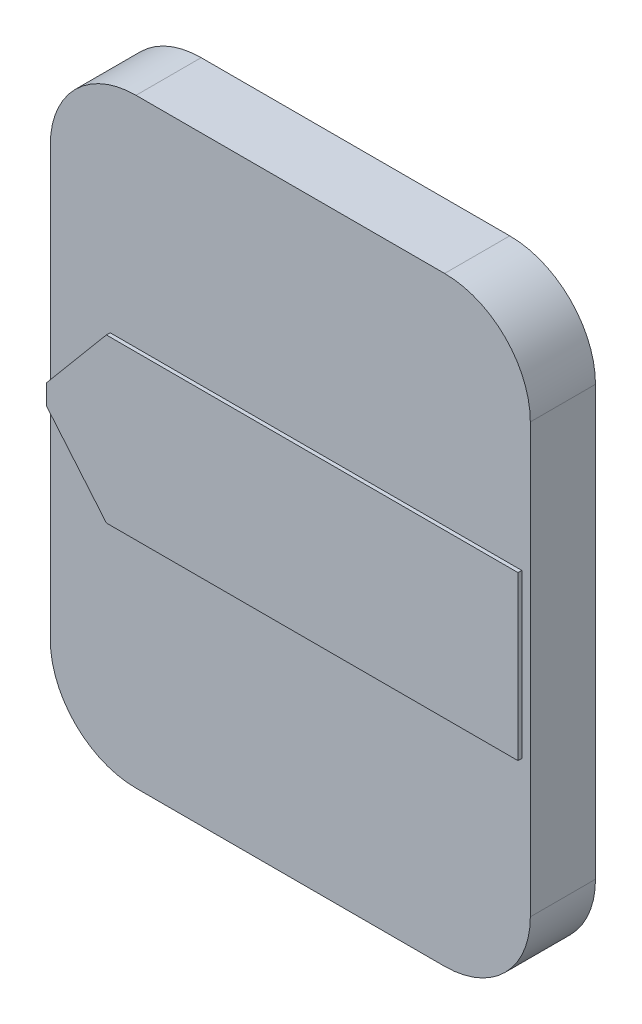
ISO-10303-21;
HEADER;
FILE_DESCRIPTION(('STEP AP214'),'2;1');
FILE_NAME('part.step','',(''),(''),'','','');
FILE_SCHEMA(('AUTOMOTIVE_DESIGN { 1 0 10303 214 1 1 1 1 }'));
ENDSEC;
DATA;
#1=APPLICATION_CONTEXT('core data for automotive mechanical design processes');
#2=APPLICATION_PROTOCOL_DEFINITION('international standard','automotive_design',2000,#1);
#3=PRODUCT_CONTEXT('',#1,'mechanical');
#4=PRODUCT('Part','Part','',(#3));
#5=PRODUCT_RELATED_PRODUCT_CATEGORY('part','',(#4));
#6=PRODUCT_DEFINITION_FORMATION('','',#4);
#7=PRODUCT_DEFINITION_CONTEXT('part definition',#1,'design');
#8=PRODUCT_DEFINITION('design','',#6,#7);
#9=PRODUCT_DEFINITION_SHAPE('','',#8);
#10=(LENGTH_UNIT() NAMED_UNIT(*) SI_UNIT(.MILLI.,.METRE.));
#11=(NAMED_UNIT(*) PLANE_ANGLE_UNIT() SI_UNIT($,.RADIAN.));
#12=(NAMED_UNIT(*) SI_UNIT($,.STERADIAN.) SOLID_ANGLE_UNIT());
#13=UNCERTAINTY_MEASURE_WITH_UNIT(LENGTH_MEASURE(1.E-05),#10,'distance_accuracy_value','');
#14=(GEOMETRIC_REPRESENTATION_CONTEXT(3) GLOBAL_UNCERTAINTY_ASSIGNED_CONTEXT((#13)) GLOBAL_UNIT_ASSIGNED_CONTEXT((#10,
#11,#12)) REPRESENTATION_CONTEXT('',''));
#15=CARTESIAN_POINT('',(0.,0.,0.));
#16=DIRECTION('',(0.,0.,1.));
#17=DIRECTION('',(1.,0.,0.));
#18=AXIS2_PLACEMENT_3D('',#15,#16,#17);
#19=CARTESIAN_POINT('',(2.79999999999999,3.50004913845652,-0.38));
#20=DIRECTION('',(0.,0.,1.));
#21=DIRECTION('',(1.,0.,0.));
#22=AXIS2_PLACEMENT_3D('',#19,#20,#21);
#23=PLANE('',#22);
#24=DIRECTION('',(0.,1.,0.));
#25=VECTOR('',#24,1.);
#26=CARTESIAN_POINT('',(2.79999999999999,-2.41954770021507E-08,-0.38));
#27=LINE('',#26,#25);
#28=CARTESIAN_POINT('',(2.79999999999999,0.499999975804522,-0.38));
#29=VERTEX_POINT('',#28);
#30=CARTESIAN_POINT('',(2.79999999999999,3.00004913845652,-0.38));
#31=VERTEX_POINT('',#30);
#32=EDGE_CURVE('E273',#29,#31,#27,.T.);
#33=ORIENTED_EDGE('',*,*,#32,.F.);
#34=CARTESIAN_POINT('',(2.29999999999999,0.499999975804522,-0.38));
#35=DIRECTION('',(0.,0.,1.));
#36=DIRECTION('',(1.,0.,0.));
#37=AXIS2_PLACEMENT_3D('',#34,#35,#36);
#38=CIRCLE('',#37,0.499999999999999);
#39=CARTESIAN_POINT('',(2.29999999999999,-2.41954770019587E-08,-0.38));
#40=VERTEX_POINT('',#39);
#41=EDGE_CURVE('E299',#29,#40,#38,.F.);
#42=ORIENTED_EDGE('',*,*,#41,.T.);
#43=DIRECTION('',(1.,0.,0.));
#44=VECTOR('',#43,1.);
#45=CARTESIAN_POINT('',(0.,-2.41954770010754E-08,-0.38));
#46=LINE('',#45,#44);
#47=CARTESIAN_POINT('',(0.499999999999978,-2.41954770012674E-08,-0.38));
#48=VERTEX_POINT('',#47);
#49=EDGE_CURVE('E277',#48,#40,#46,.T.);
#50=ORIENTED_EDGE('',*,*,#49,.F.);
#51=CARTESIAN_POINT('',(0.499999999999978,0.499999975804522,-0.38));
#52=DIRECTION('',(0.,0.,1.));
#53=DIRECTION('',(1.,0.,0.));
#54=AXIS2_PLACEMENT_3D('',#51,#52,#53);
#55=CIRCLE('',#54,0.499999999999999);
#56=CARTESIAN_POINT('',(0.,0.499999975804522,-0.38));
#57=VERTEX_POINT('',#56);
#58=EDGE_CURVE('E297',#48,#57,#55,.F.);
#59=ORIENTED_EDGE('',*,*,#58,.T.);
#60=DIRECTION('',(0.,-1.,0.));
#61=VECTOR('',#60,1.);
#62=CARTESIAN_POINT('',(0.,3.50004913845652,-0.38));
#63=LINE('',#62,#61);
#64=CARTESIAN_POINT('',(0.,3.00004913845652,-0.38));
#65=VERTEX_POINT('',#64);
#66=EDGE_CURVE('E322',#65,#57,#63,.T.);
#67=ORIENTED_EDGE('',*,*,#66,.F.);
#68=CARTESIAN_POINT('',(0.499999999999978,3.00004913845652,-0.38));
#69=DIRECTION('',(0.,0.,1.));
#70=DIRECTION('',(1.,0.,0.));
#71=AXIS2_PLACEMENT_3D('',#68,#69,#70);
#72=CIRCLE('',#71,0.499999999999999);
#73=CARTESIAN_POINT('',(0.499999999999979,3.50004913845652,-0.38));
#74=VERTEX_POINT('',#73);
#75=EDGE_CURVE('E295',#65,#74,#72,.F.);
#76=ORIENTED_EDGE('',*,*,#75,.T.);
#77=DIRECTION('',(-1.,0.,0.));
#78=VECTOR('',#77,1.);
#79=CARTESIAN_POINT('',(2.79999999999999,3.50004913845652,-0.38));
#80=LINE('',#79,#78);
#81=CARTESIAN_POINT('',(2.29999999999999,3.50004913845652,-0.38));
#82=VERTEX_POINT('',#81);
#83=EDGE_CURVE('E312',#82,#74,#80,.T.);
#84=ORIENTED_EDGE('',*,*,#83,.F.);
#85=CARTESIAN_POINT('',(2.29999999999999,3.00004913845652,-0.38));
#86=DIRECTION('',(0.,0.,1.));
#87=DIRECTION('',(1.,0.,0.));
#88=AXIS2_PLACEMENT_3D('',#85,#86,#87);
#89=CIRCLE('',#88,0.499999999999999);
#90=EDGE_CURVE('E293',#82,#31,#89,.F.);
#91=ORIENTED_EDGE('',*,*,#90,.T.);
#92=EDGE_LOOP('',(#33,#42,#50,#59,#67,#76,#84,#91));
#93=FACE_BOUND('',#92,.T.);
#94=CARTESIAN_POINT('',(2.29999999999999,3.00004913845652,-0.38));
#95=DIRECTION('',(0.,0.,-1.));
#96=DIRECTION('',(-1.,0.,0.));
#97=AXIS2_PLACEMENT_3D('',#94,#95,#96);
#98=CIRCLE('',#97,0.4);
#99=CARTESIAN_POINT('',(2.29999999999999,3.40004913845652,-0.38));
#100=VERTEX_POINT('',#99);
#101=CARTESIAN_POINT('',(2.69999999999999,3.00004913845652,-0.38));
#102=VERTEX_POINT('',#101);
#103=EDGE_CURVE('E203',#100,#102,#98,.T.);
#104=ORIENTED_EDGE('',*,*,#103,.F.);
#105=DIRECTION('',(1.,0.,0.));
#106=VECTOR('',#105,1.);
#107=CARTESIAN_POINT('',(0.499999999999979,3.40004913845652,-0.38));
#108=LINE('',#107,#106);
#109=CARTESIAN_POINT('',(0.499999999999979,3.40004913845652,-0.38));
#110=VERTEX_POINT('',#109);
#111=EDGE_CURVE('E200',#110,#100,#108,.T.);
#112=ORIENTED_EDGE('',*,*,#111,.F.);
#113=CARTESIAN_POINT('',(0.499999999999978,3.00004913845652,-0.38));
#114=DIRECTION('',(0.,0.,-1.));
#115=DIRECTION('',(-1.,0.,0.));
#116=AXIS2_PLACEMENT_3D('',#113,#114,#115);
#117=CIRCLE('',#116,0.399999999999999);
#118=CARTESIAN_POINT('',(0.0999999999999787,3.00004913845652,-0.38));
#119=VERTEX_POINT('',#118);
#120=EDGE_CURVE('E534',#119,#110,#117,.T.);
#121=ORIENTED_EDGE('',*,*,#120,.F.);
#122=DIRECTION('',(0.,1.,0.));
#123=VECTOR('',#122,1.);
#124=CARTESIAN_POINT('',(0.0999999999999789,0.499999975804522,-0.38));
#125=LINE('',#124,#123);
#126=CARTESIAN_POINT('',(0.0999999999999791,0.499999975804522,-0.38));
#127=VERTEX_POINT('',#126);
#128=EDGE_CURVE('E565',#127,#119,#125,.T.);
#129=ORIENTED_EDGE('',*,*,#128,.F.);
#130=CARTESIAN_POINT('',(0.499999999999978,0.499999975804522,-0.38));
#131=DIRECTION('',(0.,0.,-1.));
#132=DIRECTION('',(-1.,0.,0.));
#133=AXIS2_PLACEMENT_3D('',#130,#131,#132);
#134=CIRCLE('',#133,0.399999999999999);
#135=CARTESIAN_POINT('',(0.499999999999977,0.099999975804523,-0.38));
#136=VERTEX_POINT('',#135);
#137=EDGE_CURVE('E558',#136,#127,#134,.T.);
#138=ORIENTED_EDGE('',*,*,#137,.F.);
#139=DIRECTION('',(-1.,0.,0.));
#140=VECTOR('',#139,1.);
#141=CARTESIAN_POINT('',(2.29999999999999,0.0999999758045229,-0.38));
#142=LINE('',#141,#140);
#143=CARTESIAN_POINT('',(2.29999999999999,0.0999999758045231,-0.38));
#144=VERTEX_POINT('',#143);
#145=EDGE_CURVE('E555',#144,#136,#142,.T.);
#146=ORIENTED_EDGE('',*,*,#145,.F.);
#147=CARTESIAN_POINT('',(2.29999999999999,0.499999975804522,-0.38));
#148=DIRECTION('',(0.,0.,-1.));
#149=DIRECTION('',(-1.,0.,0.));
#150=AXIS2_PLACEMENT_3D('',#147,#148,#149);
#151=CIRCLE('',#150,0.399999999999999);
#152=CARTESIAN_POINT('',(2.69999999999999,0.499999975804522,-0.38));
#153=VERTEX_POINT('',#152);
#154=EDGE_CURVE('E54',#153,#144,#151,.T.);
#155=ORIENTED_EDGE('',*,*,#154,.F.);
#156=DIRECTION('',(0.,-1.,0.));
#157=VECTOR('',#156,1.);
#158=CARTESIAN_POINT('',(2.69999999999999,3.00004913845652,-0.38));
#159=LINE('',#158,#157);
#160=EDGE_CURVE('E49',#102,#153,#159,.T.);
#161=ORIENTED_EDGE('',*,*,#160,.F.);
#162=EDGE_LOOP('',(#104,#112,#121,#129,#138,#146,#155,#161));
#163=FACE_BOUND('',#162,.T.);
#164=ADVANCED_FACE('F32',(#93,#163),#23,.F.);
#165=CARTESIAN_POINT('',(2.79999999999999,-2.41954770021507E-08,-0.38));
#166=DIRECTION('',(1.,0.,0.));
#167=DIRECTION('',(0.,0.,-1.));
#168=AXIS2_PLACEMENT_3D('',#165,#166,#167);
#169=PLANE('',#168);
#170=DIRECTION('',(0.,1.,0.));
#171=VECTOR('',#170,1.);
#172=CARTESIAN_POINT('',(2.79999999999999,-2.41954770021507E-08,0.));
#173=LINE('',#172,#171);
#174=CARTESIAN_POINT('',(2.79999999999999,0.499999975804522,0.));
#175=VERTEX_POINT('',#174);
#176=CARTESIAN_POINT('',(2.79999999999999,3.00004913845652,0.));
#177=VERTEX_POINT('',#176);
#178=EDGE_CURVE('E329',#175,#177,#173,.T.);
#179=ORIENTED_EDGE('',*,*,#178,.F.);
#180=DIRECTION('',(0.,0.,1.));
#181=VECTOR('',#180,1.);
#182=CARTESIAN_POINT('',(2.79999999999999,0.499999975804522,-0.38));
#183=LINE('',#182,#181);
#184=EDGE_CURVE('E291',#175,#29,#183,.F.);
#185=ORIENTED_EDGE('',*,*,#184,.T.);
#186=ORIENTED_EDGE('',*,*,#32,.T.);
#187=DIRECTION('',(0.,0.,1.));
#188=VECTOR('',#187,1.);
#189=CARTESIAN_POINT('',(2.79999999999999,3.00004913845652,-0.38));
#190=LINE('',#189,#188);
#191=EDGE_CURVE('E288',#31,#177,#190,.T.);
#192=ORIENTED_EDGE('',*,*,#191,.T.);
#193=EDGE_LOOP('',(#179,#185,#186,#192));
#194=FACE_BOUND('',#193,.T.);
#195=ADVANCED_FACE('F328',(#194),#169,.T.);
#196=CARTESIAN_POINT('',(0.,-2.41954770010754E-08,-0.38));
#197=DIRECTION('',(0.,-1.,0.));
#198=DIRECTION('',(1.,0.,0.));
#199=AXIS2_PLACEMENT_3D('',#196,#197,#198);
#200=PLANE('',#199);
#201=ORIENTED_EDGE('',*,*,#49,.T.);
#202=DIRECTION('',(0.,0.,1.));
#203=VECTOR('',#202,1.);
#204=CARTESIAN_POINT('',(2.29999999999999,-2.41954770019587E-08,-0.38));
#205=LINE('',#204,#203);
#206=CARTESIAN_POINT('',(2.29999999999999,-2.41954770019587E-08,0.));
#207=VERTEX_POINT('',#206);
#208=EDGE_CURVE('E276',#40,#207,#205,.T.);
#209=ORIENTED_EDGE('',*,*,#208,.T.);
#210=DIRECTION('',(1.,0.,0.));
#211=VECTOR('',#210,1.);
#212=CARTESIAN_POINT('',(0.,-2.41954770010754E-08,0.));
#213=LINE('',#212,#211);
#214=CARTESIAN_POINT('',(0.499999999999978,-2.41954770012674E-08,0.));
#215=VERTEX_POINT('',#214);
#216=EDGE_CURVE('E269',#215,#207,#213,.T.);
#217=ORIENTED_EDGE('',*,*,#216,.F.);
#218=DIRECTION('',(0.,0.,1.));
#219=VECTOR('',#218,1.);
#220=CARTESIAN_POINT('',(0.499999999999978,-2.41954770012674E-08,-0.38));
#221=LINE('',#220,#219);
#222=EDGE_CURVE('E274',#215,#48,#221,.F.);
#223=ORIENTED_EDGE('',*,*,#222,.T.);
#224=EDGE_LOOP('',(#201,#209,#217,#223));
#225=FACE_BOUND('',#224,.T.);
#226=ADVANCED_FACE('F368',(#225),#200,.T.);
#227=CARTESIAN_POINT('',(0.,3.50004913845652,-0.38));
#228=DIRECTION('',(-1.,0.,0.));
#229=DIRECTION('',(0.,-1.,0.));
#230=AXIS2_PLACEMENT_3D('',#227,#228,#229);
#231=PLANE('',#230);
#232=ORIENTED_EDGE('',*,*,#66,.T.);
#233=DIRECTION('',(0.,0.,1.));
#234=VECTOR('',#233,1.);
#235=CARTESIAN_POINT('',(0.,0.499999975804522,-0.38));
#236=LINE('',#235,#234);
#237=CARTESIAN_POINT('',(0.,0.499999975804522,0.));
#238=VERTEX_POINT('',#237);
#239=EDGE_CURVE('E303',#57,#238,#236,.T.);
#240=ORIENTED_EDGE('',*,*,#239,.T.);
#241=DIRECTION('',(0.,-1.,0.));
#242=VECTOR('',#241,1.);
#243=CARTESIAN_POINT('',(0.,3.50004913845652,0.));
#244=LINE('',#243,#242);
#245=CARTESIAN_POINT('',(0.,1.6911000918899,0.));
#246=VERTEX_POINT('',#245);
#247=EDGE_CURVE('E260',#246,#238,#244,.T.);
#248=ORIENTED_EDGE('',*,*,#247,.F.);
#249=DIRECTION('',(0.,0.,-1.));
#250=VECTOR('',#249,1.);
#251=CARTESIAN_POINT('',(0.,1.6911000918899,0.022));
#252=LINE('',#251,#250);
#253=CARTESIAN_POINT('',(0.,1.6911000918899,0.022));
#254=VERTEX_POINT('',#253);
#255=EDGE_CURVE('E227',#254,#246,#252,.T.);
#256=ORIENTED_EDGE('',*,*,#255,.F.);
#257=DIRECTION('',(0.,-1.,0.));
#258=VECTOR('',#257,1.);
#259=CARTESIAN_POINT('',(0.,1.6911000918899,0.022));
#260=LINE('',#259,#258);
#261=CARTESIAN_POINT('',(0.,1.80894902237119,0.022));
#262=VERTEX_POINT('',#261);
#263=EDGE_CURVE('E225',#262,#254,#260,.T.);
#264=ORIENTED_EDGE('',*,*,#263,.F.);
#265=DIRECTION('',(0.,0.,-1.));
#266=VECTOR('',#265,1.);
#267=CARTESIAN_POINT('',(0.,1.80894902237119,0.022));
#268=LINE('',#267,#266);
#269=CARTESIAN_POINT('',(0.,1.80894902237119,0.));
#270=VERTEX_POINT('',#269);
#271=EDGE_CURVE('E245',#262,#270,#268,.T.);
#272=ORIENTED_EDGE('',*,*,#271,.T.);
#273=CARTESIAN_POINT('',(0.,3.00004913845652,0.));
#274=VERTEX_POINT('',#273);
#275=EDGE_CURVE('E263',#274,#270,#244,.T.);
#276=ORIENTED_EDGE('',*,*,#275,.F.);
#277=DIRECTION('',(0.,0.,1.));
#278=VECTOR('',#277,1.);
#279=CARTESIAN_POINT('',(0.,3.00004913845652,-0.38));
#280=LINE('',#279,#278);
#281=EDGE_CURVE('E301',#274,#65,#280,.F.);
#282=ORIENTED_EDGE('',*,*,#281,.T.);
#283=EDGE_LOOP('',(#232,#240,#248,#256,#264,#272,#276,#282));
#284=FACE_BOUND('',#283,.T.);
#285=ADVANCED_FACE('F360',(#284),#231,.T.);
#286=CARTESIAN_POINT('',(2.79999999999999,3.50004913845652,-0.38));
#287=DIRECTION('',(0.,1.,0.));
#288=DIRECTION('',(0.,0.,1.));
#289=AXIS2_PLACEMENT_3D('',#286,#287,#288);
#290=PLANE('',#289);
#291=ORIENTED_EDGE('',*,*,#83,.T.);
#292=DIRECTION('',(0.,0.,1.));
#293=VECTOR('',#292,1.);
#294=CARTESIAN_POINT('',(0.499999999999978,3.50004913845652,-0.38));
#295=LINE('',#294,#293);
#296=CARTESIAN_POINT('',(0.499999999999979,3.50004913845652,0.));
#297=VERTEX_POINT('',#296);
#298=EDGE_CURVE('E11',#74,#297,#295,.T.);
#299=ORIENTED_EDGE('',*,*,#298,.T.);
#300=DIRECTION('',(-1.,0.,0.));
#301=VECTOR('',#300,1.);
#302=CARTESIAN_POINT('',(2.79999999999999,3.50004913845652,0.));
#303=LINE('',#302,#301);
#304=CARTESIAN_POINT('',(2.29999999999999,3.50004913845652,0.));
#305=VERTEX_POINT('',#304);
#306=EDGE_CURVE('E264',#305,#297,#303,.T.);
#307=ORIENTED_EDGE('',*,*,#306,.F.);
#308=DIRECTION('',(0.,0.,1.));
#309=VECTOR('',#308,1.);
#310=CARTESIAN_POINT('',(2.29999999999999,3.50004913845652,-0.38));
#311=LINE('',#310,#309);
#312=EDGE_CURVE('E41',#305,#82,#311,.F.);
#313=ORIENTED_EDGE('',*,*,#312,.T.);
#314=EDGE_LOOP('',(#291,#299,#307,#313));
#315=FACE_BOUND('',#314,.T.);
#316=ADVANCED_FACE('F311',(#315),#290,.T.);
#317=CARTESIAN_POINT('',(2.79999999999999,3.50004913845652,0.));
#318=DIRECTION('',(0.,0.,1.));
#319=DIRECTION('',(1.,0.,0.));
#320=AXIS2_PLACEMENT_3D('',#317,#318,#319);
#321=PLANE('',#320);
#322=DIRECTION('',(0.642864495372613,-0.765979921792547,0.));
#323=VECTOR('',#322,1.);
#324=CARTESIAN_POINT('',(0.34919999999998,1.27502455713055,0.));
#325=LINE('',#324,#323);
#326=CARTESIAN_POINT('',(0.34919999999998,1.27502455713055,0.));
#327=VERTEX_POINT('',#326);
#328=EDGE_CURVE('E204',#246,#327,#325,.T.);
#329=ORIENTED_EDGE('',*,*,#328,.F.);
#330=ORIENTED_EDGE('',*,*,#247,.T.);
#331=CARTESIAN_POINT('',(0.499999999999978,0.499999975804522,0.));
#332=DIRECTION('',(0.,0.,1.));
#333=DIRECTION('',(1.,0.,0.));
#334=AXIS2_PLACEMENT_3D('',#331,#332,#333);
#335=CIRCLE('',#334,0.499999999999999);
#336=EDGE_CURVE('E284',#238,#215,#335,.T.);
#337=ORIENTED_EDGE('',*,*,#336,.T.);
#338=ORIENTED_EDGE('',*,*,#216,.T.);
#339=CARTESIAN_POINT('',(2.29999999999999,0.499999975804522,0.));
#340=DIRECTION('',(0.,0.,1.));
#341=DIRECTION('',(1.,0.,0.));
#342=AXIS2_PLACEMENT_3D('',#339,#340,#341);
#343=CIRCLE('',#342,0.499999999999999);
#344=EDGE_CURVE('E286',#207,#175,#343,.T.);
#345=ORIENTED_EDGE('',*,*,#344,.T.);
#346=ORIENTED_EDGE('',*,*,#178,.T.);
#347=CARTESIAN_POINT('',(2.29999999999999,3.00004913845652,0.));
#348=DIRECTION('',(0.,0.,1.));
#349=DIRECTION('',(1.,0.,0.));
#350=AXIS2_PLACEMENT_3D('',#347,#348,#349);
#351=CIRCLE('',#350,0.499999999999999);
#352=EDGE_CURVE('E280',#177,#305,#351,.T.);
#353=ORIENTED_EDGE('',*,*,#352,.T.);
#354=ORIENTED_EDGE('',*,*,#306,.T.);
#355=CARTESIAN_POINT('',(0.499999999999978,3.00004913845652,0.));
#356=DIRECTION('',(0.,0.,1.));
#357=DIRECTION('',(1.,0.,0.));
#358=AXIS2_PLACEMENT_3D('',#355,#356,#357);
#359=CIRCLE('',#358,0.499999999999999);
#360=EDGE_CURVE('E282',#297,#274,#359,.T.);
#361=ORIENTED_EDGE('',*,*,#360,.T.);
#362=ORIENTED_EDGE('',*,*,#275,.T.);
#363=DIRECTION('',(-0.642864495372605,-0.765979921792554,0.));
#364=VECTOR('',#363,1.);
#365=CARTESIAN_POINT('',(0.,1.80894902237119,0.));
#366=LINE('',#365,#364);
#367=CARTESIAN_POINT('',(0.349199999999977,2.22502455713055,0.));
#368=VERTEX_POINT('',#367);
#369=EDGE_CURVE('E217',#368,#270,#366,.T.);
#370=ORIENTED_EDGE('',*,*,#369,.F.);
#371=DIRECTION('',(-1.,0.,0.));
#372=VECTOR('',#371,1.);
#373=CARTESIAN_POINT('',(0.349199999999977,2.22502455713055,0.));
#374=LINE('',#373,#372);
#375=CARTESIAN_POINT('',(2.74999999999999,2.22502455713054,0.));
#376=VERTEX_POINT('',#375);
#377=EDGE_CURVE('E233',#376,#368,#374,.T.);
#378=ORIENTED_EDGE('',*,*,#377,.F.);
#379=DIRECTION('',(0.,1.,0.));
#380=VECTOR('',#379,1.);
#381=CARTESIAN_POINT('',(2.74999999999999,2.22502455713054,0.));
#382=LINE('',#381,#380);
#383=CARTESIAN_POINT('',(2.74999999999999,1.27502455713055,0.));
#384=VERTEX_POINT('',#383);
#385=EDGE_CURVE('E230',#384,#376,#382,.T.);
#386=ORIENTED_EDGE('',*,*,#385,.F.);
#387=DIRECTION('',(1.,0.,0.));
#388=VECTOR('',#387,1.);
#389=CARTESIAN_POINT('',(2.74999999999999,1.27502455713055,0.));
#390=LINE('',#389,#388);
#391=EDGE_CURVE('E207',#327,#384,#390,.T.);
#392=ORIENTED_EDGE('',*,*,#391,.F.);
#393=EDGE_LOOP('',(#329,#330,#337,#338,#345,#346,#353,#354,#361,#362,#370,#378,#386,#392));
#394=FACE_BOUND('',#393,.T.);
#395=ADVANCED_FACE('F332',(#394),#321,.T.);
#396=CARTESIAN_POINT('',(2.29999999999999,0.499999975804522,-0.38));
#397=DIRECTION('',(0.,0.,1.));
#398=DIRECTION('',(1.,0.,0.));
#399=AXIS2_PLACEMENT_3D('',#396,#397,#398);
#400=CYLINDRICAL_SURFACE('',#399,0.499999999999999);
#401=ORIENTED_EDGE('',*,*,#41,.F.);
#402=ORIENTED_EDGE('',*,*,#184,.F.);
#403=ORIENTED_EDGE('',*,*,#344,.F.);
#404=ORIENTED_EDGE('',*,*,#208,.F.);
#405=EDGE_LOOP('',(#401,#402,#403,#404));
#406=FACE_BOUND('',#405,.T.);
#407=ADVANCED_FACE('F373',(#406),#400,.T.);
#408=CARTESIAN_POINT('',(0.499999999999978,0.499999975804522,-0.38));
#409=DIRECTION('',(0.,0.,1.));
#410=DIRECTION('',(1.,0.,0.));
#411=AXIS2_PLACEMENT_3D('',#408,#409,#410);
#412=CYLINDRICAL_SURFACE('',#411,0.499999999999999);
#413=ORIENTED_EDGE('',*,*,#58,.F.);
#414=ORIENTED_EDGE('',*,*,#222,.F.);
#415=ORIENTED_EDGE('',*,*,#336,.F.);
#416=ORIENTED_EDGE('',*,*,#239,.F.);
#417=EDGE_LOOP('',(#413,#414,#415,#416));
#418=FACE_BOUND('',#417,.T.);
#419=ADVANCED_FACE('F364',(#418),#412,.T.);
#420=CARTESIAN_POINT('',(0.499999999999978,3.00004913845652,-0.38));
#421=DIRECTION('',(0.,0.,1.));
#422=DIRECTION('',(1.,0.,0.));
#423=AXIS2_PLACEMENT_3D('',#420,#421,#422);
#424=CYLINDRICAL_SURFACE('',#423,0.499999999999999);
#425=ORIENTED_EDGE('',*,*,#75,.F.);
#426=ORIENTED_EDGE('',*,*,#281,.F.);
#427=ORIENTED_EDGE('',*,*,#360,.F.);
#428=ORIENTED_EDGE('',*,*,#298,.F.);
#429=EDGE_LOOP('',(#425,#426,#427,#428));
#430=FACE_BOUND('',#429,.T.);
#431=ADVANCED_FACE('F376',(#430),#424,.T.);
#432=CARTESIAN_POINT('',(2.29999999999999,3.00004913845652,-0.38));
#433=DIRECTION('',(0.,0.,1.));
#434=DIRECTION('',(1.,0.,0.));
#435=AXIS2_PLACEMENT_3D('',#432,#433,#434);
#436=CYLINDRICAL_SURFACE('',#435,0.499999999999999);
#437=ORIENTED_EDGE('',*,*,#90,.F.);
#438=ORIENTED_EDGE('',*,*,#312,.F.);
#439=ORIENTED_EDGE('',*,*,#352,.F.);
#440=ORIENTED_EDGE('',*,*,#191,.F.);
#441=EDGE_LOOP('',(#437,#438,#439,#440));
#442=FACE_BOUND('',#441,.T.);
#443=ADVANCED_FACE('F34',(#442),#436,.T.);
#444=CARTESIAN_POINT('',(0.34919999999998,1.27502455713055,0.022));
#445=DIRECTION('',(0.765979921792547,0.642864495372612,0.));
#446=DIRECTION('',(-0.642864495372612,0.765979921792547,0.));
#447=AXIS2_PLACEMENT_3D('',#444,#445,#446);
#448=PLANE('',#447);
#449=ORIENTED_EDGE('',*,*,#328,.T.);
#450=DIRECTION('',(0.,0.,-1.));
#451=VECTOR('',#450,1.);
#452=CARTESIAN_POINT('',(0.34919999999998,1.27502455713055,0.022));
#453=LINE('',#452,#451);
#454=CARTESIAN_POINT('',(0.34919999999998,1.27502455713055,0.022));
#455=VERTEX_POINT('',#454);
#456=EDGE_CURVE('E333',#455,#327,#453,.T.);
#457=ORIENTED_EDGE('',*,*,#456,.F.);
#458=DIRECTION('',(0.642864495372613,-0.765979921792547,0.));
#459=VECTOR('',#458,1.);
#460=CARTESIAN_POINT('',(0.34919999999998,1.27502455713055,0.022));
#461=LINE('',#460,#459);
#462=EDGE_CURVE('E213',#254,#455,#461,.T.);
#463=ORIENTED_EDGE('',*,*,#462,.F.);
#464=ORIENTED_EDGE('',*,*,#255,.T.);
#465=EDGE_LOOP('',(#449,#457,#463,#464));
#466=FACE_BOUND('',#465,.T.);
#467=ADVANCED_FACE('F357',(#466),#448,.F.);
#468=CARTESIAN_POINT('',(2.74999999999999,1.27502455713055,0.022));
#469=DIRECTION('',(0.,1.,0.));
#470=DIRECTION('',(-1.,0.,0.));
#471=AXIS2_PLACEMENT_3D('',#468,#469,#470);
#472=PLANE('',#471);
#473=ORIENTED_EDGE('',*,*,#391,.T.);
#474=DIRECTION('',(0.,0.,-1.));
#475=VECTOR('',#474,1.);
#476=CARTESIAN_POINT('',(2.74999999999999,1.27502455713055,0.022));
#477=LINE('',#476,#475);
#478=CARTESIAN_POINT('',(2.74999999999999,1.27502455713055,0.022));
#479=VERTEX_POINT('',#478);
#480=EDGE_CURVE('E335',#479,#384,#477,.T.);
#481=ORIENTED_EDGE('',*,*,#480,.F.);
#482=DIRECTION('',(1.,0.,0.));
#483=VECTOR('',#482,1.);
#484=CARTESIAN_POINT('',(2.74999999999999,1.27502455713055,0.022));
#485=LINE('',#484,#483);
#486=EDGE_CURVE('E216',#455,#479,#485,.T.);
#487=ORIENTED_EDGE('',*,*,#486,.F.);
#488=ORIENTED_EDGE('',*,*,#456,.T.);
#489=EDGE_LOOP('',(#473,#481,#487,#488));
#490=FACE_BOUND('',#489,.T.);
#491=ADVANCED_FACE('F355',(#490),#472,.F.);
#492=CARTESIAN_POINT('',(2.74999999999999,2.22502455713054,0.022));
#493=DIRECTION('',(-1.,0.,0.));
#494=DIRECTION('',(0.,0.,1.));
#495=AXIS2_PLACEMENT_3D('',#492,#493,#494);
#496=PLANE('',#495);
#497=ORIENTED_EDGE('',*,*,#385,.T.);
#498=DIRECTION('',(0.,0.,-1.));
#499=VECTOR('',#498,1.);
#500=CARTESIAN_POINT('',(2.74999999999999,2.22502455713054,0.022));
#501=LINE('',#500,#499);
#502=CARTESIAN_POINT('',(2.74999999999999,2.22502455713054,0.022));
#503=VERTEX_POINT('',#502);
#504=EDGE_CURVE('E252',#503,#376,#501,.T.);
#505=ORIENTED_EDGE('',*,*,#504,.F.);
#506=DIRECTION('',(0.,1.,0.));
#507=VECTOR('',#506,1.);
#508=CARTESIAN_POINT('',(2.74999999999999,2.22502455713054,0.022));
#509=LINE('',#508,#507);
#510=EDGE_CURVE('E219',#479,#503,#509,.T.);
#511=ORIENTED_EDGE('',*,*,#510,.F.);
#512=ORIENTED_EDGE('',*,*,#480,.T.);
#513=EDGE_LOOP('',(#497,#505,#511,#512));
#514=FACE_BOUND('',#513,.T.);
#515=ADVANCED_FACE('F352',(#514),#496,.F.);
#516=CARTESIAN_POINT('',(0.349199999999977,2.22502455713055,0.022));
#517=DIRECTION('',(0.,-1.,0.));
#518=DIRECTION('',(1.,0.,0.));
#519=AXIS2_PLACEMENT_3D('',#516,#517,#518);
#520=PLANE('',#519);
#521=ORIENTED_EDGE('',*,*,#377,.T.);
#522=DIRECTION('',(0.,0.,-1.));
#523=VECTOR('',#522,1.);
#524=CARTESIAN_POINT('',(0.349199999999977,2.22502455713055,0.022));
#525=LINE('',#524,#523);
#526=CARTESIAN_POINT('',(0.349199999999977,2.22502455713055,0.022));
#527=VERTEX_POINT('',#526);
#528=EDGE_CURVE('E238',#527,#368,#525,.T.);
#529=ORIENTED_EDGE('',*,*,#528,.F.);
#530=DIRECTION('',(-1.,0.,0.));
#531=VECTOR('',#530,1.);
#532=CARTESIAN_POINT('',(0.349199999999977,2.22502455713055,0.022));
#533=LINE('',#532,#531);
#534=EDGE_CURVE('E221',#503,#527,#533,.T.);
#535=ORIENTED_EDGE('',*,*,#534,.F.);
#536=ORIENTED_EDGE('',*,*,#504,.T.);
#537=EDGE_LOOP('',(#521,#529,#535,#536));
#538=FACE_BOUND('',#537,.T.);
#539=ADVANCED_FACE('F348',(#538),#520,.F.);
#540=CARTESIAN_POINT('',(0.,1.80894902237119,0.022));
#541=DIRECTION('',(0.765979921792554,-0.642864495372605,0.));
#542=DIRECTION('',(0.642864495372605,0.765979921792554,0.));
#543=AXIS2_PLACEMENT_3D('',#540,#541,#542);
#544=PLANE('',#543);
#545=ORIENTED_EDGE('',*,*,#369,.T.);
#546=ORIENTED_EDGE('',*,*,#271,.F.);
#547=DIRECTION('',(-0.642864495372605,-0.765979921792554,0.));
#548=VECTOR('',#547,1.);
#549=CARTESIAN_POINT('',(0.,1.80894902237119,0.022));
#550=LINE('',#549,#548);
#551=EDGE_CURVE('E223',#527,#262,#550,.T.);
#552=ORIENTED_EDGE('',*,*,#551,.F.);
#553=ORIENTED_EDGE('',*,*,#528,.T.);
#554=EDGE_LOOP('',(#545,#546,#552,#553));
#555=FACE_BOUND('',#554,.T.);
#556=ADVANCED_FACE('F378',(#555),#544,.F.);
#557=CARTESIAN_POINT('',(-0.0494535764376147,1.75002455713054,0.022));
#558=DIRECTION('',(0.,0.,-1.));
#559=DIRECTION('',(-1.,0.,0.));
#560=AXIS2_PLACEMENT_3D('',#557,#558,#559);
#561=PLANE('',#560);
#562=ORIENTED_EDGE('',*,*,#462,.T.);
#563=ORIENTED_EDGE('',*,*,#486,.T.);
#564=ORIENTED_EDGE('',*,*,#510,.T.);
#565=ORIENTED_EDGE('',*,*,#534,.T.);
#566=ORIENTED_EDGE('',*,*,#551,.T.);
#567=ORIENTED_EDGE('',*,*,#263,.T.);
#568=EDGE_LOOP('',(#562,#563,#564,#565,#566,#567));
#569=FACE_BOUND('',#568,.T.);
#570=ADVANCED_FACE('F381',(#569),#561,.F.);
#571=CARTESIAN_POINT('',(2.29999999999999,3.00004913845652,-0.402));
#572=DIRECTION('',(0.,0.,1.));
#573=DIRECTION('',(1.,0.,0.));
#574=AXIS2_PLACEMENT_3D('',#571,#572,#573);
#575=CYLINDRICAL_SURFACE('',#574,0.4);
#576=ORIENTED_EDGE('',*,*,#103,.T.);
#577=DIRECTION('',(0.,0.,1.));
#578=VECTOR('',#577,1.);
#579=CARTESIAN_POINT('',(2.69999999999999,3.00004913845652,-0.402));
#580=LINE('',#579,#578);
#581=CARTESIAN_POINT('',(2.69999999999999,3.00004913845652,-0.402));
#582=VERTEX_POINT('',#581);
#583=EDGE_CURVE('E184',#582,#102,#580,.T.);
#584=ORIENTED_EDGE('',*,*,#583,.F.);
#585=CARTESIAN_POINT('',(2.29999999999999,3.00004913845652,-0.402));
#586=DIRECTION('',(0.,0.,-1.));
#587=DIRECTION('',(-1.,0.,0.));
#588=AXIS2_PLACEMENT_3D('',#585,#586,#587);
#589=CIRCLE('',#588,0.4);
#590=CARTESIAN_POINT('',(2.29999999999999,3.40004913845652,-0.402));
#591=VERTEX_POINT('',#590);
#592=EDGE_CURVE('E191',#591,#582,#589,.T.);
#593=ORIENTED_EDGE('',*,*,#592,.F.);
#594=DIRECTION('',(0.,0.,1.));
#595=VECTOR('',#594,1.);
#596=CARTESIAN_POINT('',(2.29999999999999,3.40004913845652,-0.402));
#597=LINE('',#596,#595);
#598=EDGE_CURVE('E530',#591,#100,#597,.T.);
#599=ORIENTED_EDGE('',*,*,#598,.T.);
#600=EDGE_LOOP('',(#576,#584,#593,#599));
#601=FACE_BOUND('',#600,.T.);
#602=ADVANCED_FACE('F202',(#601),#575,.T.);
#603=CARTESIAN_POINT('',(2.69999999999999,3.00004913845652,-0.402));
#604=DIRECTION('',(-1.,0.,0.));
#605=DIRECTION('',(0.,0.,1.));
#606=AXIS2_PLACEMENT_3D('',#603,#604,#605);
#607=PLANE('',#606);
#608=ORIENTED_EDGE('',*,*,#160,.T.);
#609=DIRECTION('',(0.,0.,1.));
#610=VECTOR('',#609,1.);
#611=CARTESIAN_POINT('',(2.69999999999999,0.499999975804522,-0.402));
#612=LINE('',#611,#610);
#613=CARTESIAN_POINT('',(2.69999999999999,0.499999975804522,-0.402));
#614=VERTEX_POINT('',#613);
#615=EDGE_CURVE('E187',#614,#153,#612,.T.);
#616=ORIENTED_EDGE('',*,*,#615,.F.);
#617=DIRECTION('',(0.,-1.,0.));
#618=VECTOR('',#617,1.);
#619=CARTESIAN_POINT('',(2.69999999999999,3.00004913845652,-0.402));
#620=LINE('',#619,#618);
#621=EDGE_CURVE('E180',#582,#614,#620,.T.);
#622=ORIENTED_EDGE('',*,*,#621,.F.);
#623=ORIENTED_EDGE('',*,*,#583,.T.);
#624=EDGE_LOOP('',(#608,#616,#622,#623));
#625=FACE_BOUND('',#624,.T.);
#626=ADVANCED_FACE('F182',(#625),#607,.F.);
#627=CARTESIAN_POINT('',(2.29999999999999,0.499999975804522,-0.402));
#628=DIRECTION('',(0.,0.,1.));
#629=DIRECTION('',(1.,0.,0.));
#630=AXIS2_PLACEMENT_3D('',#627,#628,#629);
#631=CYLINDRICAL_SURFACE('',#630,0.399999999999999);
#632=ORIENTED_EDGE('',*,*,#154,.T.);
#633=DIRECTION('',(0.,0.,1.));
#634=VECTOR('',#633,1.);
#635=CARTESIAN_POINT('',(2.29999999999999,0.0999999758045228,-0.402));
#636=LINE('',#635,#634);
#637=CARTESIAN_POINT('',(2.29999999999999,0.0999999758045228,-0.402));
#638=VERTEX_POINT('',#637);
#639=EDGE_CURVE('E209',#638,#144,#636,.T.);
#640=ORIENTED_EDGE('',*,*,#639,.F.);
#641=CARTESIAN_POINT('',(2.29999999999999,0.499999975804522,-0.402));
#642=DIRECTION('',(0.,0.,-1.));
#643=DIRECTION('',(-1.,0.,0.));
#644=AXIS2_PLACEMENT_3D('',#641,#642,#643);
#645=CIRCLE('',#644,0.399999999999999);
#646=EDGE_CURVE('E190',#614,#638,#645,.T.);
#647=ORIENTED_EDGE('',*,*,#646,.F.);
#648=ORIENTED_EDGE('',*,*,#615,.T.);
#649=EDGE_LOOP('',(#632,#640,#647,#648));
#650=FACE_BOUND('',#649,.T.);
#651=ADVANCED_FACE('F457',(#650),#631,.T.);
#652=CARTESIAN_POINT('',(2.29999999999999,0.0999999758045229,-0.402));
#653=DIRECTION('',(0.,1.,0.));
#654=DIRECTION('',(-1.,0.,0.));
#655=AXIS2_PLACEMENT_3D('',#652,#653,#654);
#656=PLANE('',#655);
#657=ORIENTED_EDGE('',*,*,#145,.T.);
#658=DIRECTION('',(0.,0.,1.));
#659=VECTOR('',#658,1.);
#660=CARTESIAN_POINT('',(0.499999999999977,0.099999975804523,-0.402));
#661=LINE('',#660,#659);
#662=CARTESIAN_POINT('',(0.499999999999977,0.099999975804523,-0.402));
#663=VERTEX_POINT('',#662);
#664=EDGE_CURVE('E548',#663,#136,#661,.T.);
#665=ORIENTED_EDGE('',*,*,#664,.F.);
#666=DIRECTION('',(-1.,0.,0.));
#667=VECTOR('',#666,1.);
#668=CARTESIAN_POINT('',(2.29999999999999,0.0999999758045229,-0.402));
#669=LINE('',#668,#667);
#670=EDGE_CURVE('E556',#638,#663,#669,.T.);
#671=ORIENTED_EDGE('',*,*,#670,.F.);
#672=ORIENTED_EDGE('',*,*,#639,.T.);
#673=EDGE_LOOP('',(#657,#665,#671,#672));
#674=FACE_BOUND('',#673,.T.);
#675=ADVANCED_FACE('F466',(#674),#656,.F.);
#676=CARTESIAN_POINT('',(0.499999999999978,0.499999975804522,-0.402));
#677=DIRECTION('',(0.,0.,1.));
#678=DIRECTION('',(1.,0.,0.));
#679=AXIS2_PLACEMENT_3D('',#676,#677,#678);
#680=CYLINDRICAL_SURFACE('',#679,0.399999999999999);
#681=ORIENTED_EDGE('',*,*,#137,.T.);
#682=DIRECTION('',(0.,0.,1.));
#683=VECTOR('',#682,1.);
#684=CARTESIAN_POINT('',(0.0999999999999789,0.499999975804522,-0.402));
#685=LINE('',#684,#683);
#686=CARTESIAN_POINT('',(0.0999999999999789,0.499999975804522,-0.402));
#687=VERTEX_POINT('',#686);
#688=EDGE_CURVE('E545',#687,#127,#685,.T.);
#689=ORIENTED_EDGE('',*,*,#688,.F.);
#690=CARTESIAN_POINT('',(0.499999999999978,0.499999975804522,-0.402));
#691=DIRECTION('',(0.,0.,-1.));
#692=DIRECTION('',(-1.,0.,0.));
#693=AXIS2_PLACEMENT_3D('',#690,#691,#692);
#694=CIRCLE('',#693,0.399999999999999);
#695=EDGE_CURVE('E573',#663,#687,#694,.T.);
#696=ORIENTED_EDGE('',*,*,#695,.F.);
#697=ORIENTED_EDGE('',*,*,#664,.T.);
#698=EDGE_LOOP('',(#681,#689,#696,#697));
#699=FACE_BOUND('',#698,.T.);
#700=ADVANCED_FACE('F476',(#699),#680,.T.);
#701=CARTESIAN_POINT('',(0.0999999999999789,0.499999975804522,-0.402));
#702=DIRECTION('',(1.,0.,0.));
#703=DIRECTION('',(0.,1.,0.));
#704=AXIS2_PLACEMENT_3D('',#701,#702,#703);
#705=PLANE('',#704);
#706=ORIENTED_EDGE('',*,*,#128,.T.);
#707=DIRECTION('',(0.,0.,1.));
#708=VECTOR('',#707,1.);
#709=CARTESIAN_POINT('',(0.0999999999999787,3.00004913845652,-0.402));
#710=LINE('',#709,#708);
#711=CARTESIAN_POINT('',(0.0999999999999787,3.00004913845652,-0.402));
#712=VERTEX_POINT('',#711);
#713=EDGE_CURVE('E537',#712,#119,#710,.T.);
#714=ORIENTED_EDGE('',*,*,#713,.F.);
#715=DIRECTION('',(0.,1.,0.));
#716=VECTOR('',#715,1.);
#717=CARTESIAN_POINT('',(0.0999999999999789,0.499999975804522,-0.402));
#718=LINE('',#717,#716);
#719=EDGE_CURVE('E571',#687,#712,#718,.T.);
#720=ORIENTED_EDGE('',*,*,#719,.F.);
#721=ORIENTED_EDGE('',*,*,#688,.T.);
#722=EDGE_LOOP('',(#706,#714,#720,#721));
#723=FACE_BOUND('',#722,.T.);
#724=ADVANCED_FACE('F486',(#723),#705,.F.);
#725=CARTESIAN_POINT('',(0.499999999999978,3.00004913845652,-0.402));
#726=DIRECTION('',(0.,0.,1.));
#727=DIRECTION('',(1.,0.,0.));
#728=AXIS2_PLACEMENT_3D('',#725,#726,#727);
#729=CYLINDRICAL_SURFACE('',#728,0.399999999999999);
#730=ORIENTED_EDGE('',*,*,#120,.T.);
#731=DIRECTION('',(0.,0.,1.));
#732=VECTOR('',#731,1.);
#733=CARTESIAN_POINT('',(0.499999999999979,3.40004913845652,-0.402));
#734=LINE('',#733,#732);
#735=CARTESIAN_POINT('',(0.499999999999979,3.40004913845652,-0.402));
#736=VERTEX_POINT('',#735);
#737=EDGE_CURVE('E532',#736,#110,#734,.T.);
#738=ORIENTED_EDGE('',*,*,#737,.F.);
#739=CARTESIAN_POINT('',(0.499999999999978,3.00004913845652,-0.402));
#740=DIRECTION('',(0.,0.,-1.));
#741=DIRECTION('',(-1.,0.,0.));
#742=AXIS2_PLACEMENT_3D('',#739,#740,#741);
#743=CIRCLE('',#742,0.399999999999999);
#744=EDGE_CURVE('E539',#712,#736,#743,.T.);
#745=ORIENTED_EDGE('',*,*,#744,.F.);
#746=ORIENTED_EDGE('',*,*,#713,.T.);
#747=EDGE_LOOP('',(#730,#738,#745,#746));
#748=FACE_BOUND('',#747,.T.);
#749=ADVANCED_FACE('F496',(#748),#729,.T.);
#750=CARTESIAN_POINT('',(0.499999999999979,3.40004913845652,-0.402));
#751=DIRECTION('',(0.,-1.,0.));
#752=DIRECTION('',(0.,0.,-1.));
#753=AXIS2_PLACEMENT_3D('',#750,#751,#752);
#754=PLANE('',#753);
#755=ORIENTED_EDGE('',*,*,#111,.T.);
#756=ORIENTED_EDGE('',*,*,#598,.F.);
#757=DIRECTION('',(1.,0.,0.));
#758=VECTOR('',#757,1.);
#759=CARTESIAN_POINT('',(0.499999999999979,3.40004913845652,-0.402));
#760=LINE('',#759,#758);
#761=EDGE_CURVE('E196',#736,#591,#760,.T.);
#762=ORIENTED_EDGE('',*,*,#761,.F.);
#763=ORIENTED_EDGE('',*,*,#737,.T.);
#764=EDGE_LOOP('',(#755,#756,#762,#763));
#765=FACE_BOUND('',#764,.T.);
#766=ADVANCED_FACE('F506',(#765),#754,.F.);
#767=CARTESIAN_POINT('',(2.29999999999999,3.00004913845652,-0.402));
#768=DIRECTION('',(0.,0.,-1.));
#769=DIRECTION('',(-1.,0.,0.));
#770=AXIS2_PLACEMENT_3D('',#767,#768,#769);
#771=PLANE('',#770);
#772=ORIENTED_EDGE('',*,*,#592,.T.);
#773=ORIENTED_EDGE('',*,*,#621,.T.);
#774=ORIENTED_EDGE('',*,*,#646,.T.);
#775=ORIENTED_EDGE('',*,*,#670,.T.);
#776=ORIENTED_EDGE('',*,*,#695,.T.);
#777=ORIENTED_EDGE('',*,*,#719,.T.);
#778=ORIENTED_EDGE('',*,*,#744,.T.);
#779=ORIENTED_EDGE('',*,*,#761,.T.);
#780=EDGE_LOOP('',(#772,#773,#774,#775,#776,#777,#778,#779));
#781=FACE_BOUND('',#780,.T.);
#782=ADVANCED_FACE('F194',(#781),#771,.T.);
#783=CLOSED_SHELL('',(#164,#195,#226,#285,#316,#395,#407,#419,#431,#443,#467,#491,#515,#539,
#556,#570,#602,#626,#651,#675,#700,#724,#749,#766,#782));
#784=MANIFOLD_SOLID_BREP('B2',#783);
#785=ADVANCED_BREP_SHAPE_REPRESENTATION('',(#18,#784),#14);
#786=SHAPE_DEFINITION_REPRESENTATION(#9,#785);
ENDSEC;
END-ISO-10303-21;
